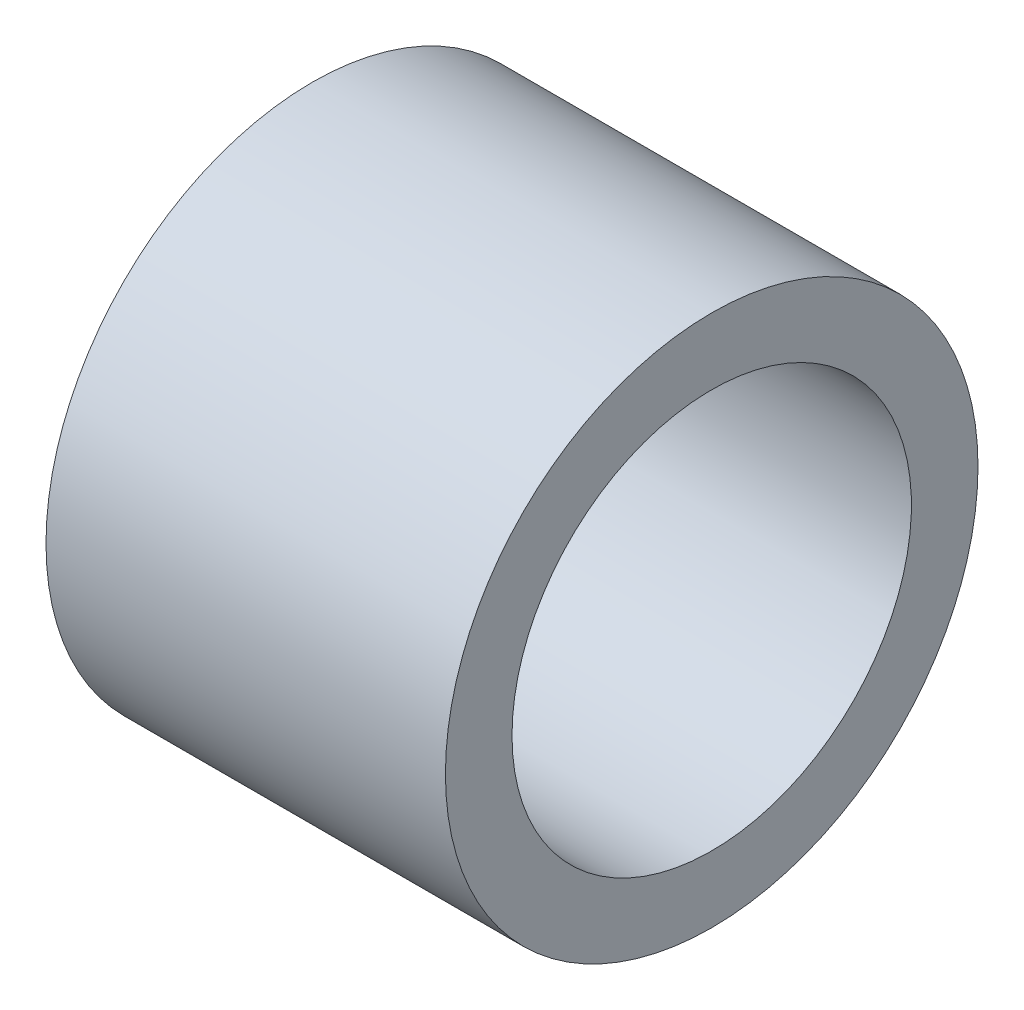
ISO-10303-21;
HEADER;
FILE_DESCRIPTION(('STEP AP214'),'2;1');
FILE_NAME('part.step','',(''),(''),'','','');
FILE_SCHEMA(('AUTOMOTIVE_DESIGN { 1 0 10303 214 1 1 1 1 }'));
ENDSEC;
DATA;
#1=APPLICATION_CONTEXT('core data for automotive mechanical design processes');
#2=APPLICATION_PROTOCOL_DEFINITION('international standard','automotive_design',2000,#1);
#3=PRODUCT_CONTEXT('',#1,'mechanical');
#4=PRODUCT('Part','Part','',(#3));
#5=PRODUCT_RELATED_PRODUCT_CATEGORY('part','',(#4));
#6=PRODUCT_DEFINITION_FORMATION('','',#4);
#7=PRODUCT_DEFINITION_CONTEXT('part definition',#1,'design');
#8=PRODUCT_DEFINITION('design','',#6,#7);
#9=PRODUCT_DEFINITION_SHAPE('','',#8);
#10=(LENGTH_UNIT() NAMED_UNIT(*) SI_UNIT(.MILLI.,.METRE.));
#11=(NAMED_UNIT(*) PLANE_ANGLE_UNIT() SI_UNIT($,.RADIAN.));
#12=(NAMED_UNIT(*) SI_UNIT($,.STERADIAN.) SOLID_ANGLE_UNIT());
#13=UNCERTAINTY_MEASURE_WITH_UNIT(LENGTH_MEASURE(1.E-05),#10,'distance_accuracy_value','');
#14=(GEOMETRIC_REPRESENTATION_CONTEXT(3) GLOBAL_UNCERTAINTY_ASSIGNED_CONTEXT((#13)) GLOBAL_UNIT_ASSIGNED_CONTEXT((#10,
#11,#12)) REPRESENTATION_CONTEXT('',''));
#15=CARTESIAN_POINT('',(0.,0.,0.));
#16=DIRECTION('',(0.,0.,1.));
#17=DIRECTION('',(1.,0.,0.));
#18=AXIS2_PLACEMENT_3D('',#15,#16,#17);
#19=CARTESIAN_POINT('',(9.525,0.,0.));
#20=DIRECTION('',(1.,0.,0.));
#21=DIRECTION('',(0.,0.,-1.));
#22=AXIS2_PLACEMENT_3D('',#19,#20,#21);
#23=PLANE('',#22);
#24=CARTESIAN_POINT('',(9.525,0.,0.));
#25=DIRECTION('',(1.,0.,0.));
#26=DIRECTION('',(0.,0.,-1.));
#27=AXIS2_PLACEMENT_3D('',#24,#25,#26);
#28=CIRCLE('',#27,12.7);
#29=CARTESIAN_POINT('',(9.525,0.,12.7));
#30=VERTEX_POINT('',#29);
#31=EDGE_CURVE('E10',#30,#30,#28,.T.);
#32=ORIENTED_EDGE('',*,*,#31,.T.);
#33=EDGE_LOOP('',(#32));
#34=FACE_BOUND('',#33,.T.);
#35=CARTESIAN_POINT('',(9.525,0.,0.));
#36=DIRECTION('',(1.,0.,0.));
#37=DIRECTION('',(0.,0.,-1.));
#38=AXIS2_PLACEMENT_3D('',#35,#36,#37);
#39=CIRCLE('',#38,9.525);
#40=CARTESIAN_POINT('',(9.525,0.,9.525));
#41=VERTEX_POINT('',#40);
#42=EDGE_CURVE('E44',#41,#41,#39,.T.);
#43=ORIENTED_EDGE('',*,*,#42,.F.);
#44=EDGE_LOOP('',(#43));
#45=FACE_BOUND('',#44,.T.);
#46=ADVANCED_FACE('F33',(#34,#45),#23,.T.);
#47=CARTESIAN_POINT('',(-9.525,0.,0.));
#48=DIRECTION('',(1.,0.,0.));
#49=DIRECTION('',(0.,0.,-1.));
#50=AXIS2_PLACEMENT_3D('',#47,#48,#49);
#51=PLANE('',#50);
#52=CARTESIAN_POINT('',(-9.525,0.,0.));
#53=DIRECTION('',(1.,0.,0.));
#54=DIRECTION('',(0.,0.,-1.));
#55=AXIS2_PLACEMENT_3D('',#52,#53,#54);
#56=CIRCLE('',#55,12.7);
#57=CARTESIAN_POINT('',(-9.525,0.,12.7));
#58=VERTEX_POINT('',#57);
#59=EDGE_CURVE('E37',#58,#58,#56,.T.);
#60=ORIENTED_EDGE('',*,*,#59,.F.);
#61=EDGE_LOOP('',(#60));
#62=FACE_BOUND('',#61,.T.);
#63=CARTESIAN_POINT('',(-9.525,0.,0.));
#64=DIRECTION('',(1.,0.,0.));
#65=DIRECTION('',(0.,0.,-1.));
#66=AXIS2_PLACEMENT_3D('',#63,#64,#65);
#67=CIRCLE('',#66,9.525);
#68=CARTESIAN_POINT('',(-9.525,0.,9.525));
#69=VERTEX_POINT('',#68);
#70=EDGE_CURVE('E46',#69,#69,#67,.T.);
#71=ORIENTED_EDGE('',*,*,#70,.T.);
#72=EDGE_LOOP('',(#71));
#73=FACE_BOUND('',#72,.T.);
#74=ADVANCED_FACE('F56',(#62,#73),#51,.F.);
#75=CARTESIAN_POINT('',(9.525,0.,0.));
#76=DIRECTION('',(-1.,0.,0.));
#77=DIRECTION('',(0.,0.,1.));
#78=AXIS2_PLACEMENT_3D('',#75,#76,#77);
#79=CYLINDRICAL_SURFACE('',#78,12.7);
#80=CARTESIAN_POINT('',(9.525,0.,12.7));
#81=CARTESIAN_POINT('',(9.3265625,0.,12.7));
#82=CARTESIAN_POINT('',(9.128125,0.,12.7));
#83=CARTESIAN_POINT('',(8.73125,0.,12.7));
#84=CARTESIAN_POINT('',(8.5328125,0.,12.7));
#85=CARTESIAN_POINT('',(8.1359375,0.,12.7));
#86=CARTESIAN_POINT('',(7.9375,0.,12.7));
#87=CARTESIAN_POINT('',(7.540625,0.,12.7));
#88=CARTESIAN_POINT('',(7.3421875,0.,12.7));
#89=CARTESIAN_POINT('',(6.9453125,0.,12.7));
#90=CARTESIAN_POINT('',(6.746875,0.,12.7));
#91=CARTESIAN_POINT('',(6.35,0.,12.7));
#92=CARTESIAN_POINT('',(6.1515625,0.,12.7));
#93=CARTESIAN_POINT('',(5.7546875,0.,12.7));
#94=CARTESIAN_POINT('',(5.55625,0.,12.7));
#95=CARTESIAN_POINT('',(5.159375,0.,12.7));
#96=CARTESIAN_POINT('',(4.9609375,0.,12.7));
#97=CARTESIAN_POINT('',(4.5640625,0.,12.7));
#98=CARTESIAN_POINT('',(4.365625,0.,12.7));
#99=CARTESIAN_POINT('',(3.96875,0.,12.7));
#100=CARTESIAN_POINT('',(3.7703125,0.,12.7));
#101=CARTESIAN_POINT('',(3.3734375,0.,12.7));
#102=CARTESIAN_POINT('',(3.175,0.,12.7));
#103=CARTESIAN_POINT('',(2.778125,0.,12.7));
#104=CARTESIAN_POINT('',(2.5796875,0.,12.7));
#105=CARTESIAN_POINT('',(2.1828125,0.,12.7));
#106=CARTESIAN_POINT('',(1.984375,0.,12.7));
#107=CARTESIAN_POINT('',(1.5875,0.,12.7));
#108=CARTESIAN_POINT('',(1.3890625,0.,12.7));
#109=CARTESIAN_POINT('',(0.992187499999999,0.,12.7));
#110=CARTESIAN_POINT('',(0.793749999999999,0.,12.7));
#111=CARTESIAN_POINT('',(0.396874999999998,0.,12.7));
#112=CARTESIAN_POINT('',(0.198437499999998,0.,12.7));
#113=CARTESIAN_POINT('',(-0.198437500000002,0.,12.7));
#114=CARTESIAN_POINT('',(-0.396875000000002,0.,12.7));
#115=CARTESIAN_POINT('',(-0.793750000000002,0.,12.7));
#116=CARTESIAN_POINT('',(-0.992187500000002,0.,12.7));
#117=CARTESIAN_POINT('',(-1.3890625,0.,12.7));
#118=CARTESIAN_POINT('',(-1.5875,0.,12.7));
#119=CARTESIAN_POINT('',(-1.984375,0.,12.7));
#120=CARTESIAN_POINT('',(-2.1828125,0.,12.7));
#121=CARTESIAN_POINT('',(-2.5796875,0.,12.7));
#122=CARTESIAN_POINT('',(-2.778125,0.,12.7));
#123=CARTESIAN_POINT('',(-3.175,0.,12.7));
#124=CARTESIAN_POINT('',(-3.3734375,0.,12.7));
#125=CARTESIAN_POINT('',(-3.7703125,0.,12.7));
#126=CARTESIAN_POINT('',(-3.96875,0.,12.7));
#127=CARTESIAN_POINT('',(-4.365625,0.,12.7));
#128=CARTESIAN_POINT('',(-4.5640625,0.,12.7));
#129=CARTESIAN_POINT('',(-4.9609375,0.,12.7));
#130=CARTESIAN_POINT('',(-5.159375,0.,12.7));
#131=CARTESIAN_POINT('',(-5.55625,0.,12.7));
#132=CARTESIAN_POINT('',(-5.7546875,0.,12.7));
#133=CARTESIAN_POINT('',(-6.1515625,0.,12.7));
#134=CARTESIAN_POINT('',(-6.35,0.,12.7));
#135=CARTESIAN_POINT('',(-6.746875,0.,12.7));
#136=CARTESIAN_POINT('',(-6.9453125,0.,12.7));
#137=CARTESIAN_POINT('',(-7.3421875,0.,12.7));
#138=CARTESIAN_POINT('',(-7.540625,0.,12.7));
#139=CARTESIAN_POINT('',(-7.9375,0.,12.7));
#140=CARTESIAN_POINT('',(-8.1359375,0.,12.7));
#141=CARTESIAN_POINT('',(-8.5328125,0.,12.7));
#142=CARTESIAN_POINT('',(-8.73125,0.,12.7));
#143=CARTESIAN_POINT('',(-9.128125,0.,12.7));
#144=CARTESIAN_POINT('',(-9.3265625,0.,12.7));
#145=CARTESIAN_POINT('',(-9.525,0.,12.7));
#146=B_SPLINE_CURVE_WITH_KNOTS('',3,(#80,#81,#82,#83,#84,#85,#86,#87,#88,#89,#90,#91,#92,#93,
#94,#95,#96,#97,#98,#99,#100,#101,#102,#103,#104,#105,#106,#107,#108,#109,#110,#111,#112,#113,
#114,#115,#116,#117,#118,#119,#120,#121,#122,#123,#124,#125,#126,#127,#128,#129,#130,#131,#132,
#133,#134,#135,#136,#137,#138,#139,#140,#141,#142,#143,#144,#145),.UNSPECIFIED.,.F.,.F.,(4,2,2,
2,2,2,2,2,2,2,2,2,2,2,2,2,2,2,2,2,2,2,2,2,2,2,2,2,2,2,2,2,4),(0.,0.595312499999999,1.190625,
1.7859375,2.38125,2.9765625,3.571875,4.1671875,4.7625,5.3578125,5.953125,6.5484375,7.14375,
7.7390625,8.334375,8.9296875,9.525,10.1203125,10.715625,11.3109375,11.90625,12.5015625,
13.096875,13.6921875,14.2875,14.8828125,15.478125,16.0734375,16.66875,17.2640625,17.859375,
18.4546875,19.05),.UNSPECIFIED.);
#147=EDGE_CURVE('BSEAM35',#30,#58,#146,.T.);
#148=ORIENTED_EDGE('',*,*,#31,.F.);
#149=ORIENTED_EDGE('',*,*,#59,.T.);
#150=ORIENTED_EDGE('',*,*,#147,.T.);
#151=ORIENTED_EDGE('',*,*,#147,.F.);
#152=EDGE_LOOP('',(#148,#150,#149,#151));
#153=FACE_BOUND('',#152,.T.);
#154=ADVANCED_FACE('F35',(#153),#79,.T.);
#155=CARTESIAN_POINT('',(9.525,0.,0.));
#156=DIRECTION('',(-1.,0.,0.));
#157=DIRECTION('',(0.,0.,1.));
#158=AXIS2_PLACEMENT_3D('',#155,#156,#157);
#159=CYLINDRICAL_SURFACE('',#158,9.525);
#160=CARTESIAN_POINT('',(9.525,0.,9.525));
#161=CARTESIAN_POINT('',(9.3265625,0.,9.525));
#162=CARTESIAN_POINT('',(9.128125,0.,9.525));
#163=CARTESIAN_POINT('',(8.73125,0.,9.525));
#164=CARTESIAN_POINT('',(8.5328125,0.,9.525));
#165=CARTESIAN_POINT('',(8.1359375,0.,9.525));
#166=CARTESIAN_POINT('',(7.9375,0.,9.525));
#167=CARTESIAN_POINT('',(7.540625,0.,9.525));
#168=CARTESIAN_POINT('',(7.3421875,0.,9.525));
#169=CARTESIAN_POINT('',(6.9453125,0.,9.525));
#170=CARTESIAN_POINT('',(6.746875,0.,9.525));
#171=CARTESIAN_POINT('',(6.35,0.,9.525));
#172=CARTESIAN_POINT('',(6.1515625,0.,9.525));
#173=CARTESIAN_POINT('',(5.7546875,0.,9.525));
#174=CARTESIAN_POINT('',(5.55625,0.,9.525));
#175=CARTESIAN_POINT('',(5.159375,0.,9.525));
#176=CARTESIAN_POINT('',(4.9609375,0.,9.525));
#177=CARTESIAN_POINT('',(4.5640625,0.,9.525));
#178=CARTESIAN_POINT('',(4.365625,0.,9.525));
#179=CARTESIAN_POINT('',(3.96875,0.,9.525));
#180=CARTESIAN_POINT('',(3.7703125,0.,9.525));
#181=CARTESIAN_POINT('',(3.3734375,0.,9.525));
#182=CARTESIAN_POINT('',(3.175,0.,9.525));
#183=CARTESIAN_POINT('',(2.778125,0.,9.525));
#184=CARTESIAN_POINT('',(2.5796875,0.,9.525));
#185=CARTESIAN_POINT('',(2.1828125,0.,9.525));
#186=CARTESIAN_POINT('',(1.984375,0.,9.525));
#187=CARTESIAN_POINT('',(1.5875,0.,9.525));
#188=CARTESIAN_POINT('',(1.3890625,0.,9.525));
#189=CARTESIAN_POINT('',(0.992187500000001,0.,9.525));
#190=CARTESIAN_POINT('',(0.793750000000001,0.,9.525));
#191=CARTESIAN_POINT('',(0.396875,0.,9.525));
#192=CARTESIAN_POINT('',(0.1984375,0.,9.525));
#193=CARTESIAN_POINT('',(-0.1984375,0.,9.525));
#194=CARTESIAN_POINT('',(-0.396875,0.,9.525));
#195=CARTESIAN_POINT('',(-0.793750000000001,0.,9.525));
#196=CARTESIAN_POINT('',(-0.992187500000001,0.,9.525));
#197=CARTESIAN_POINT('',(-1.3890625,0.,9.525));
#198=CARTESIAN_POINT('',(-1.5875,0.,9.525));
#199=CARTESIAN_POINT('',(-1.984375,0.,9.525));
#200=CARTESIAN_POINT('',(-2.1828125,0.,9.525));
#201=CARTESIAN_POINT('',(-2.5796875,0.,9.525));
#202=CARTESIAN_POINT('',(-2.778125,0.,9.525));
#203=CARTESIAN_POINT('',(-3.175,0.,9.525));
#204=CARTESIAN_POINT('',(-3.3734375,0.,9.525));
#205=CARTESIAN_POINT('',(-3.7703125,0.,9.525));
#206=CARTESIAN_POINT('',(-3.96875,0.,9.525));
#207=CARTESIAN_POINT('',(-4.365625,0.,9.525));
#208=CARTESIAN_POINT('',(-4.5640625,0.,9.525));
#209=CARTESIAN_POINT('',(-4.9609375,0.,9.525));
#210=CARTESIAN_POINT('',(-5.159375,0.,9.525));
#211=CARTESIAN_POINT('',(-5.55625,0.,9.525));
#212=CARTESIAN_POINT('',(-5.7546875,0.,9.525));
#213=CARTESIAN_POINT('',(-6.1515625,0.,9.525));
#214=CARTESIAN_POINT('',(-6.35,0.,9.525));
#215=CARTESIAN_POINT('',(-6.746875,0.,9.525));
#216=CARTESIAN_POINT('',(-6.9453125,0.,9.525));
#217=CARTESIAN_POINT('',(-7.3421875,0.,9.525));
#218=CARTESIAN_POINT('',(-7.540625,0.,9.525));
#219=CARTESIAN_POINT('',(-7.9375,0.,9.525));
#220=CARTESIAN_POINT('',(-8.1359375,0.,9.525));
#221=CARTESIAN_POINT('',(-8.5328125,0.,9.525));
#222=CARTESIAN_POINT('',(-8.73125,0.,9.525));
#223=CARTESIAN_POINT('',(-9.128125,0.,9.525));
#224=CARTESIAN_POINT('',(-9.3265625,0.,9.525));
#225=CARTESIAN_POINT('',(-9.525,0.,9.525));
#226=B_SPLINE_CURVE_WITH_KNOTS('',3,(#160,#161,#162,#163,#164,#165,#166,#167,#168,#169,#170,
#171,#172,#173,#174,#175,#176,#177,#178,#179,#180,#181,#182,#183,#184,#185,#186,#187,#188,#189,
#190,#191,#192,#193,#194,#195,#196,#197,#198,#199,#200,#201,#202,#203,#204,#205,#206,#207,#208,
#209,#210,#211,#212,#213,#214,#215,#216,#217,#218,#219,#220,#221,#222,#223,#224,#225),
.UNSPECIFIED.,.F.,.F.,(4,2,2,2,2,2,2,2,2,2,2,2,2,2,2,2,2,2,2,2,2,2,2,2,2,2,2,2,2,2,2,2,4),(0.,
0.5953125,1.190625,1.7859375,2.38125,2.9765625,3.571875,4.1671875,4.7625,5.3578125,5.953125,
6.5484375,7.14375,7.7390625,8.334375,8.9296875,9.525,10.1203125,10.715625,11.3109375,11.90625,
12.5015625,13.096875,13.6921875,14.2875,14.8828125,15.478125,16.0734375,16.66875,17.2640625,
17.859375,18.4546875,19.05),.UNSPECIFIED.);
#227=EDGE_CURVE('BSEAM52',#41,#69,#226,.T.);
#228=ORIENTED_EDGE('',*,*,#42,.T.);
#229=ORIENTED_EDGE('',*,*,#70,.F.);
#230=ORIENTED_EDGE('',*,*,#227,.T.);
#231=ORIENTED_EDGE('',*,*,#227,.F.);
#232=EDGE_LOOP('',(#228,#230,#229,#231));
#233=FACE_BOUND('',#232,.T.);
#234=ADVANCED_FACE('F52',(#233),#159,.F.);
#235=CLOSED_SHELL('',(#46,#74,#154,#234));
#236=MANIFOLD_SOLID_BREP('B2',#235);
#237=ADVANCED_BREP_SHAPE_REPRESENTATION('',(#18,#236),#14);
#238=SHAPE_DEFINITION_REPRESENTATION(#9,#237);
ENDSEC;
END-ISO-10303-21;
